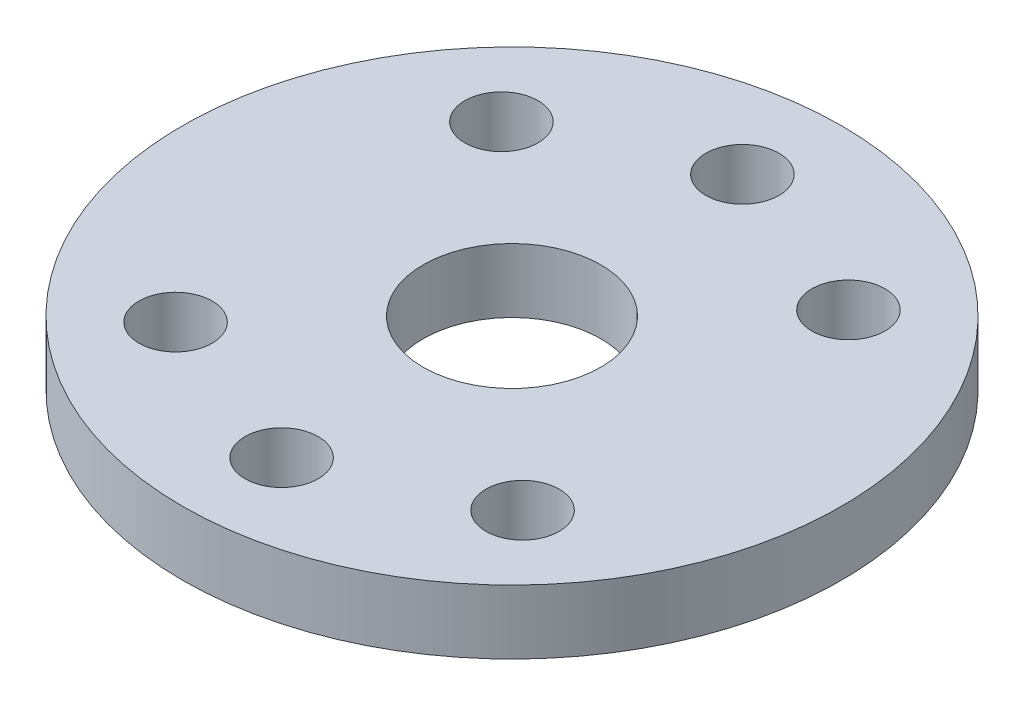
ISO-10303-21;
HEADER;
FILE_DESCRIPTION(('STEP AP214'),'2;1');
FILE_NAME('part.step','',(''),(''),'','','');
FILE_SCHEMA(('AUTOMOTIVE_DESIGN { 1 0 10303 214 1 1 1 1 }'));
ENDSEC;
DATA;
#1=APPLICATION_CONTEXT('core data for automotive mechanical design processes');
#2=APPLICATION_PROTOCOL_DEFINITION('international standard','automotive_design',2000,#1);
#3=PRODUCT_CONTEXT('',#1,'mechanical');
#4=PRODUCT('Part','Part','',(#3));
#5=PRODUCT_RELATED_PRODUCT_CATEGORY('part','',(#4));
#6=PRODUCT_DEFINITION_FORMATION('','',#4);
#7=PRODUCT_DEFINITION_CONTEXT('part definition',#1,'design');
#8=PRODUCT_DEFINITION('design','',#6,#7);
#9=PRODUCT_DEFINITION_SHAPE('','',#8);
#10=(LENGTH_UNIT() NAMED_UNIT(*) SI_UNIT(.MILLI.,.METRE.));
#11=(NAMED_UNIT(*) PLANE_ANGLE_UNIT() SI_UNIT($,.RADIAN.));
#12=(NAMED_UNIT(*) SI_UNIT($,.STERADIAN.) SOLID_ANGLE_UNIT());
#13=UNCERTAINTY_MEASURE_WITH_UNIT(LENGTH_MEASURE(1.E-05),#10,'distance_accuracy_value','');
#14=(GEOMETRIC_REPRESENTATION_CONTEXT(3) GLOBAL_UNCERTAINTY_ASSIGNED_CONTEXT((#13)) GLOBAL_UNIT_ASSIGNED_CONTEXT((#10,
#11,#12)) REPRESENTATION_CONTEXT('',''));
#15=CARTESIAN_POINT('',(0.,0.,0.));
#16=DIRECTION('',(0.,0.,1.));
#17=DIRECTION('',(1.,0.,0.));
#18=AXIS2_PLACEMENT_3D('',#15,#16,#17);
#19=CARTESIAN_POINT('',(0.,3.5,0.));
#20=DIRECTION('',(0.,1.,0.));
#21=DIRECTION('',(0.,0.,1.));
#22=AXIS2_PLACEMENT_3D('',#19,#20,#21);
#23=PLANE('',#22);
#24=CARTESIAN_POINT('',(-8.89864026865123,3.5,9.47703547366642));
#25=DIRECTION('',(0.,1.,0.));
#26=DIRECTION('',(0.,0.,1.));
#27=AXIS2_PLACEMENT_3D('',#24,#25,#26);
#28=CIRCLE('',#27,2.);
#29=CARTESIAN_POINT('',(-8.89864026865123,3.5,11.4770354736664));
#30=VERTEX_POINT('',#29);
#31=EDGE_CURVE('E78',#30,#30,#28,.T.);
#32=ORIENTED_EDGE('',*,*,#31,.F.);
#33=EDGE_LOOP('',(#32));
#34=FACE_BOUND('',#33,.T.);
#35=CARTESIAN_POINT('',(0.408987171671458,3.5,12.9935649262799));
#36=DIRECTION('',(0.,1.,0.));
#37=DIRECTION('',(0.,0.,1.));
#38=AXIS2_PLACEMENT_3D('',#35,#36,#37);
#39=CIRCLE('',#38,2.);
#40=CARTESIAN_POINT('',(0.408987171671458,3.5,14.9935649262799));
#41=VERTEX_POINT('',#40);
#42=EDGE_CURVE('E72',#41,#41,#39,.T.);
#43=ORIENTED_EDGE('',*,*,#42,.F.);
#44=EDGE_LOOP('',(#43));
#45=FACE_BOUND('',#44,.T.);
#46=CARTESIAN_POINT('',(9.47703547366682,3.5,8.89864026865494));
#47=DIRECTION('',(0.,1.,0.));
#48=DIRECTION('',(0.,0.,1.));
#49=AXIS2_PLACEMENT_3D('',#46,#47,#48);
#50=CIRCLE('',#49,2.);
#51=CARTESIAN_POINT('',(9.47703547366682,3.5,10.8986402686549));
#52=VERTEX_POINT('',#51);
#53=EDGE_CURVE('E66',#52,#52,#50,.T.);
#54=ORIENTED_EDGE('',*,*,#53,.F.);
#55=EDGE_LOOP('',(#54));
#56=FACE_BOUND('',#55,.T.);
#57=CARTESIAN_POINT('',(8.89864026865534,3.5,-9.47703547366331));
#58=DIRECTION('',(0.,1.,0.));
#59=DIRECTION('',(0.,0.,1.));
#60=AXIS2_PLACEMENT_3D('',#57,#58,#59);
#61=CIRCLE('',#60,2.);
#62=CARTESIAN_POINT('',(8.89864026865534,3.5,-7.47703547366331));
#63=VERTEX_POINT('',#62);
#64=EDGE_CURVE('E60',#63,#63,#61,.T.);
#65=ORIENTED_EDGE('',*,*,#64,.F.);
#66=EDGE_LOOP('',(#65));
#67=FACE_BOUND('',#66,.T.);
#68=CARTESIAN_POINT('',(-9.47703547366272,3.5,-8.89864026865183));
#69=DIRECTION('',(0.,1.,0.));
#70=DIRECTION('',(0.,0.,1.));
#71=AXIS2_PLACEMENT_3D('',#68,#69,#70);
#72=CIRCLE('',#71,2.);
#73=CARTESIAN_POINT('',(-9.47703547366272,3.5,-6.89864026865183));
#74=VERTEX_POINT('',#73);
#75=EDGE_CURVE('E54',#74,#74,#72,.T.);
#76=ORIENTED_EDGE('',*,*,#75,.F.);
#77=EDGE_LOOP('',(#76));
#78=FACE_BOUND('',#77,.T.);
#79=CARTESIAN_POINT('',(-0.40898717166735,3.5,-12.9935649262768));
#80=DIRECTION('',(0.,1.,0.));
#81=DIRECTION('',(0.,0.,1.));
#82=AXIS2_PLACEMENT_3D('',#79,#80,#81);
#83=CIRCLE('',#82,2.);
#84=CARTESIAN_POINT('',(-0.40898717166735,3.5,-10.9935649262768));
#85=VERTEX_POINT('',#84);
#86=EDGE_CURVE('E48',#85,#85,#83,.T.);
#87=ORIENTED_EDGE('',*,*,#86,.F.);
#88=EDGE_LOOP('',(#87));
#89=FACE_BOUND('',#88,.T.);
#90=CARTESIAN_POINT('',(0.,3.5,0.));
#91=DIRECTION('',(0.,1.,0.));
#92=DIRECTION('',(0.,0.,1.));
#93=AXIS2_PLACEMENT_3D('',#90,#91,#92);
#94=CIRCLE('',#93,18.);
#95=CARTESIAN_POINT('',(0.,3.5,18.));
#96=VERTEX_POINT('',#95);
#97=EDGE_CURVE('E10',#96,#96,#94,.T.);
#98=ORIENTED_EDGE('',*,*,#97,.T.);
#99=EDGE_LOOP('',(#98));
#100=FACE_BOUND('',#99,.T.);
#101=CARTESIAN_POINT('',(0.,3.5,0.));
#102=DIRECTION('',(0.,1.,0.));
#103=DIRECTION('',(0.,0.,1.));
#104=AXIS2_PLACEMENT_3D('',#101,#102,#103);
#105=CIRCLE('',#104,4.85);
#106=CARTESIAN_POINT('',(0.,3.5,4.85));
#107=VERTEX_POINT('',#106);
#108=EDGE_CURVE('E40',#107,#107,#105,.T.);
#109=ORIENTED_EDGE('',*,*,#108,.F.);
#110=EDGE_LOOP('',(#109));
#111=FACE_BOUND('',#110,.T.);
#112=ADVANCED_FACE('F29',(#34,#45,#56,#67,#78,#89,#100,#111),#23,.T.);
#113=CARTESIAN_POINT('',(0.,0.,0.));
#114=DIRECTION('',(0.,1.,0.));
#115=DIRECTION('',(0.,0.,1.));
#116=AXIS2_PLACEMENT_3D('',#113,#114,#115);
#117=PLANE('',#116);
#118=CARTESIAN_POINT('',(-8.89864026865123,0.,9.47703547366642));
#119=DIRECTION('',(0.,1.,0.));
#120=DIRECTION('',(0.,0.,1.));
#121=AXIS2_PLACEMENT_3D('',#118,#119,#120);
#122=CIRCLE('',#121,2.);
#123=CARTESIAN_POINT('',(-8.89864026865123,0.,11.4770354736664));
#124=VERTEX_POINT('',#123);
#125=EDGE_CURVE('E75',#124,#124,#122,.T.);
#126=ORIENTED_EDGE('',*,*,#125,.T.);
#127=EDGE_LOOP('',(#126));
#128=FACE_BOUND('',#127,.T.);
#129=CARTESIAN_POINT('',(0.408987171671458,0.,12.9935649262799));
#130=DIRECTION('',(0.,1.,0.));
#131=DIRECTION('',(0.,0.,1.));
#132=AXIS2_PLACEMENT_3D('',#129,#130,#131);
#133=CIRCLE('',#132,2.);
#134=CARTESIAN_POINT('',(0.408987171671458,0.,14.9935649262799));
#135=VERTEX_POINT('',#134);
#136=EDGE_CURVE('E69',#135,#135,#133,.T.);
#137=ORIENTED_EDGE('',*,*,#136,.T.);
#138=EDGE_LOOP('',(#137));
#139=FACE_BOUND('',#138,.T.);
#140=CARTESIAN_POINT('',(9.47703547366682,0.,8.89864026865494));
#141=DIRECTION('',(0.,1.,0.));
#142=DIRECTION('',(0.,0.,1.));
#143=AXIS2_PLACEMENT_3D('',#140,#141,#142);
#144=CIRCLE('',#143,2.);
#145=CARTESIAN_POINT('',(9.47703547366682,0.,10.8986402686549));
#146=VERTEX_POINT('',#145);
#147=EDGE_CURVE('E63',#146,#146,#144,.T.);
#148=ORIENTED_EDGE('',*,*,#147,.T.);
#149=EDGE_LOOP('',(#148));
#150=FACE_BOUND('',#149,.T.);
#151=CARTESIAN_POINT('',(8.89864026865534,0.,-9.47703547366331));
#152=DIRECTION('',(0.,1.,0.));
#153=DIRECTION('',(0.,0.,1.));
#154=AXIS2_PLACEMENT_3D('',#151,#152,#153);
#155=CIRCLE('',#154,2.);
#156=CARTESIAN_POINT('',(8.89864026865534,0.,-7.47703547366331));
#157=VERTEX_POINT('',#156);
#158=EDGE_CURVE('E57',#157,#157,#155,.T.);
#159=ORIENTED_EDGE('',*,*,#158,.T.);
#160=EDGE_LOOP('',(#159));
#161=FACE_BOUND('',#160,.T.);
#162=CARTESIAN_POINT('',(-9.47703547366272,0.,-8.89864026865183));
#163=DIRECTION('',(0.,1.,0.));
#164=DIRECTION('',(0.,0.,1.));
#165=AXIS2_PLACEMENT_3D('',#162,#163,#164);
#166=CIRCLE('',#165,2.);
#167=CARTESIAN_POINT('',(-9.47703547366272,0.,-6.89864026865183));
#168=VERTEX_POINT('',#167);
#169=EDGE_CURVE('E51',#168,#168,#166,.T.);
#170=ORIENTED_EDGE('',*,*,#169,.T.);
#171=EDGE_LOOP('',(#170));
#172=FACE_BOUND('',#171,.T.);
#173=CARTESIAN_POINT('',(-0.40898717166735,0.,-12.9935649262768));
#174=DIRECTION('',(0.,1.,0.));
#175=DIRECTION('',(0.,0.,1.));
#176=AXIS2_PLACEMENT_3D('',#173,#174,#175);
#177=CIRCLE('',#176,2.);
#178=CARTESIAN_POINT('',(-0.40898717166735,0.,-10.9935649262768));
#179=VERTEX_POINT('',#178);
#180=EDGE_CURVE('E45',#179,#179,#177,.T.);
#181=ORIENTED_EDGE('',*,*,#180,.T.);
#182=EDGE_LOOP('',(#181));
#183=FACE_BOUND('',#182,.T.);
#184=CARTESIAN_POINT('',(0.,0.,0.));
#185=DIRECTION('',(0.,1.,0.));
#186=DIRECTION('',(0.,0.,1.));
#187=AXIS2_PLACEMENT_3D('',#184,#185,#186);
#188=CIRCLE('',#187,18.);
#189=CARTESIAN_POINT('',(0.,0.,18.));
#190=VERTEX_POINT('',#189);
#191=EDGE_CURVE('E33',#190,#190,#188,.T.);
#192=ORIENTED_EDGE('',*,*,#191,.F.);
#193=EDGE_LOOP('',(#192));
#194=FACE_BOUND('',#193,.T.);
#195=CARTESIAN_POINT('',(0.,0.,0.));
#196=DIRECTION('',(0.,1.,0.));
#197=DIRECTION('',(0.,0.,1.));
#198=AXIS2_PLACEMENT_3D('',#195,#196,#197);
#199=CIRCLE('',#198,4.85);
#200=CARTESIAN_POINT('',(0.,0.,4.85));
#201=VERTEX_POINT('',#200);
#202=EDGE_CURVE('E42',#201,#201,#199,.T.);
#203=ORIENTED_EDGE('',*,*,#202,.T.);
#204=EDGE_LOOP('',(#203));
#205=FACE_BOUND('',#204,.T.);
#206=ADVANCED_FACE('F84',(#128,#139,#150,#161,#172,#183,#194,#205),#117,.F.);
#207=CARTESIAN_POINT('',(0.,3.5,0.));
#208=DIRECTION('',(0.,-1.,0.));
#209=DIRECTION('',(0.,0.,-1.));
#210=AXIS2_PLACEMENT_3D('',#207,#208,#209);
#211=CYLINDRICAL_SURFACE('',#210,18.);
#212=ORIENTED_EDGE('',*,*,#97,.F.);
#213=EDGE_LOOP('',(#212));
#214=FACE_BOUND('',#213,.T.);
#215=ORIENTED_EDGE('',*,*,#191,.T.);
#216=EDGE_LOOP('',(#215));
#217=FACE_BOUND('',#216,.T.);
#218=ADVANCED_FACE('F31',(#214,#217),#211,.T.);
#219=CARTESIAN_POINT('',(0.,3.5,0.));
#220=DIRECTION('',(0.,-1.,0.));
#221=DIRECTION('',(0.,0.,-1.));
#222=AXIS2_PLACEMENT_3D('',#219,#220,#221);
#223=CYLINDRICAL_SURFACE('',#222,4.85);
#224=ORIENTED_EDGE('',*,*,#108,.T.);
#225=EDGE_LOOP('',(#224));
#226=FACE_BOUND('',#225,.T.);
#227=ORIENTED_EDGE('',*,*,#202,.F.);
#228=EDGE_LOOP('',(#227));
#229=FACE_BOUND('',#228,.T.);
#230=ADVANCED_FACE('F109',(#226,#229),#223,.F.);
#231=CARTESIAN_POINT('',(-0.40898717166735,0.,-12.9935649262768));
#232=DIRECTION('',(0.,1.,0.));
#233=DIRECTION('',(0.,0.,1.));
#234=AXIS2_PLACEMENT_3D('',#231,#232,#233);
#235=CYLINDRICAL_SURFACE('',#234,2.);
#236=ORIENTED_EDGE('',*,*,#180,.F.);
#237=EDGE_LOOP('',(#236));
#238=FACE_BOUND('',#237,.T.);
#239=ORIENTED_EDGE('',*,*,#86,.T.);
#240=EDGE_LOOP('',(#239));
#241=FACE_BOUND('',#240,.T.);
#242=ADVANCED_FACE('F112',(#238,#241),#235,.F.);
#243=CARTESIAN_POINT('',(-9.47703547366272,0.,-8.89864026865183));
#244=DIRECTION('',(0.,1.,0.));
#245=DIRECTION('',(0.,0.,1.));
#246=AXIS2_PLACEMENT_3D('',#243,#244,#245);
#247=CYLINDRICAL_SURFACE('',#246,2.);
#248=ORIENTED_EDGE('',*,*,#169,.F.);
#249=EDGE_LOOP('',(#248));
#250=FACE_BOUND('',#249,.T.);
#251=ORIENTED_EDGE('',*,*,#75,.T.);
#252=EDGE_LOOP('',(#251));
#253=FACE_BOUND('',#252,.T.);
#254=ADVANCED_FACE('F125',(#250,#253),#247,.F.);
#255=CARTESIAN_POINT('',(8.89864026865534,0.,-9.47703547366331));
#256=DIRECTION('',(0.,1.,0.));
#257=DIRECTION('',(0.,0.,1.));
#258=AXIS2_PLACEMENT_3D('',#255,#256,#257);
#259=CYLINDRICAL_SURFACE('',#258,2.);
#260=ORIENTED_EDGE('',*,*,#158,.F.);
#261=EDGE_LOOP('',(#260));
#262=FACE_BOUND('',#261,.T.);
#263=ORIENTED_EDGE('',*,*,#64,.T.);
#264=EDGE_LOOP('',(#263));
#265=FACE_BOUND('',#264,.T.);
#266=ADVANCED_FACE('F129',(#262,#265),#259,.F.);
#267=CARTESIAN_POINT('',(9.47703547366682,0.,8.89864026865494));
#268=DIRECTION('',(0.,1.,0.));
#269=DIRECTION('',(0.,0.,1.));
#270=AXIS2_PLACEMENT_3D('',#267,#268,#269);
#271=CYLINDRICAL_SURFACE('',#270,2.);
#272=ORIENTED_EDGE('',*,*,#147,.F.);
#273=EDGE_LOOP('',(#272));
#274=FACE_BOUND('',#273,.T.);
#275=ORIENTED_EDGE('',*,*,#53,.T.);
#276=EDGE_LOOP('',(#275));
#277=FACE_BOUND('',#276,.T.);
#278=ADVANCED_FACE('F133',(#274,#277),#271,.F.);
#279=CARTESIAN_POINT('',(0.408987171671458,0.,12.9935649262799));
#280=DIRECTION('',(0.,1.,0.));
#281=DIRECTION('',(0.,0.,1.));
#282=AXIS2_PLACEMENT_3D('',#279,#280,#281);
#283=CYLINDRICAL_SURFACE('',#282,2.);
#284=ORIENTED_EDGE('',*,*,#136,.F.);
#285=EDGE_LOOP('',(#284));
#286=FACE_BOUND('',#285,.T.);
#287=ORIENTED_EDGE('',*,*,#42,.T.);
#288=EDGE_LOOP('',(#287));
#289=FACE_BOUND('',#288,.T.);
#290=ADVANCED_FACE('F90',(#286,#289),#283,.F.);
#291=CARTESIAN_POINT('',(-8.89864026865123,0.,9.47703547366642));
#292=DIRECTION('',(0.,1.,0.));
#293=DIRECTION('',(0.,0.,1.));
#294=AXIS2_PLACEMENT_3D('',#291,#292,#293);
#295=CYLINDRICAL_SURFACE('',#294,2.);
#296=ORIENTED_EDGE('',*,*,#125,.F.);
#297=EDGE_LOOP('',(#296));
#298=FACE_BOUND('',#297,.T.);
#299=ORIENTED_EDGE('',*,*,#31,.T.);
#300=EDGE_LOOP('',(#299));
#301=FACE_BOUND('',#300,.T.);
#302=ADVANCED_FACE('F87',(#298,#301),#295,.F.);
#303=CLOSED_SHELL('',(#112,#206,#218,#230,#242,#254,#266,#278,#290,#302));
#304=MANIFOLD_SOLID_BREP('B2',#303);
#305=ADVANCED_BREP_SHAPE_REPRESENTATION('',(#18,#304),#14);
#306=SHAPE_DEFINITION_REPRESENTATION(#9,#305);
ENDSEC;
END-ISO-10303-21;
